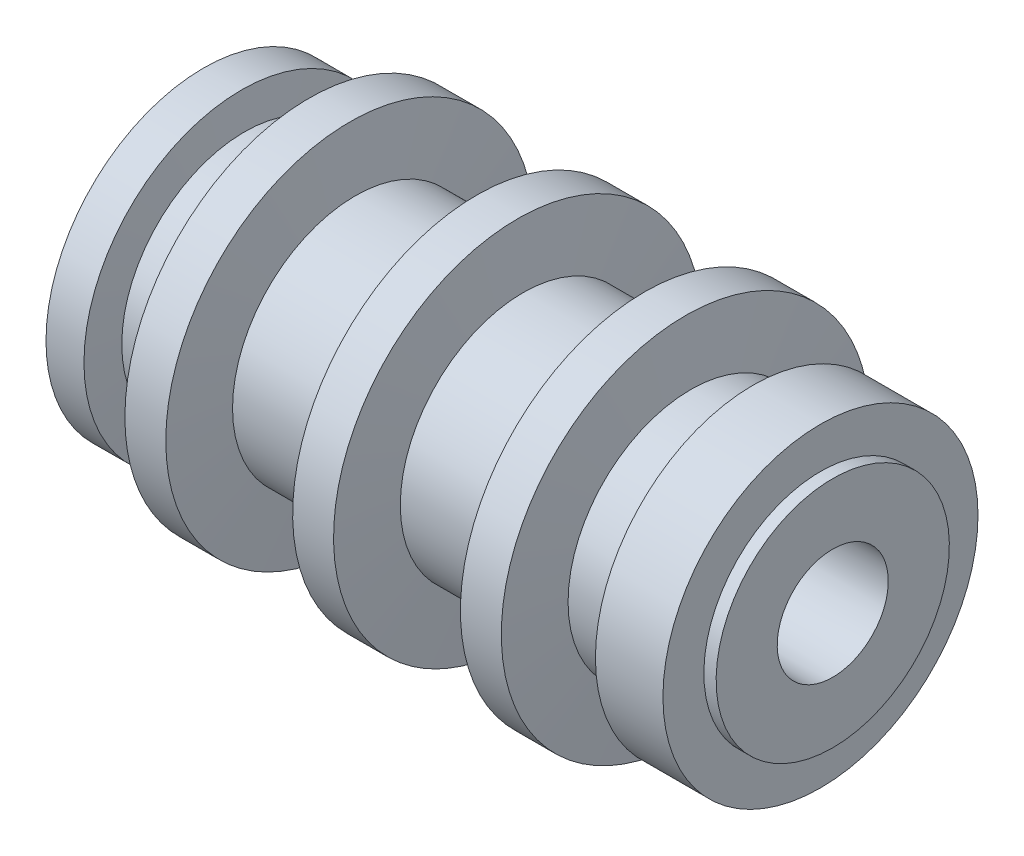
ISO-10303-21;
HEADER;
FILE_DESCRIPTION(('STEP AP214'),'2;1');
FILE_NAME('part.step','',(''),(''),'','','');
FILE_SCHEMA(('AUTOMOTIVE_DESIGN { 1 0 10303 214 1 1 1 1 }'));
ENDSEC;
DATA;
#1=APPLICATION_CONTEXT('core data for automotive mechanical design processes');
#2=APPLICATION_PROTOCOL_DEFINITION('international standard','automotive_design',2000,#1);
#3=PRODUCT_CONTEXT('',#1,'mechanical');
#4=PRODUCT('Part','Part','',(#3));
#5=PRODUCT_RELATED_PRODUCT_CATEGORY('part','',(#4));
#6=PRODUCT_DEFINITION_FORMATION('','',#4);
#7=PRODUCT_DEFINITION_CONTEXT('part definition',#1,'design');
#8=PRODUCT_DEFINITION('design','',#6,#7);
#9=PRODUCT_DEFINITION_SHAPE('','',#8);
#10=(LENGTH_UNIT() NAMED_UNIT(*) SI_UNIT(.MILLI.,.METRE.));
#11=(NAMED_UNIT(*) PLANE_ANGLE_UNIT() SI_UNIT($,.RADIAN.));
#12=(NAMED_UNIT(*) SI_UNIT($,.STERADIAN.) SOLID_ANGLE_UNIT());
#13=UNCERTAINTY_MEASURE_WITH_UNIT(LENGTH_MEASURE(1.E-05),#10,'distance_accuracy_value','');
#14=(GEOMETRIC_REPRESENTATION_CONTEXT(3) GLOBAL_UNCERTAINTY_ASSIGNED_CONTEXT((#13)) GLOBAL_UNIT_ASSIGNED_CONTEXT((#10,
#11,#12)) REPRESENTATION_CONTEXT('',''));
#15=CARTESIAN_POINT('',(0.,0.,0.));
#16=DIRECTION('',(0.,0.,1.));
#17=DIRECTION('',(1.,0.,0.));
#18=AXIS2_PLACEMENT_3D('',#15,#16,#17);
#19=CARTESIAN_POINT('',(-0.250000000000005,24.,0.));
#20=DIRECTION('',(-1.,0.,0.));
#21=DIRECTION('',(0.,0.,1.));
#22=AXIS2_PLACEMENT_3D('',#19,#20,#21);
#23=CYLINDRICAL_SURFACE('',#22,4.5);
#24=CARTESIAN_POINT('',(0.500000000009497,24.,0.));
#25=DIRECTION('',(-1.,0.,0.));
#26=DIRECTION('',(0.,0.819112477739385,-0.573632939092278));
#27=AXIS2_PLACEMENT_3D('',#24,#25,#26);
#28=CIRCLE('',#27,4.50000000002733);
#29=CARTESIAN_POINT('',(0.500000000009493,27.6860061498496,-2.58134822593092));
#30=VERTEX_POINT('',#29);
#31=EDGE_CURVE('E31',#30,#30,#28,.F.);
#32=ORIENTED_EDGE('',*,*,#31,.F.);
#33=EDGE_LOOP('',(#32));
#34=FACE_BOUND('',#33,.T.);
#35=CARTESIAN_POINT('',(-0.500000000009492,24.,0.));
#36=DIRECTION('',(1.,0.,0.));
#37=DIRECTION('',(0.,-0.819112477743409,0.573632939086532));
#38=AXIS2_PLACEMENT_3D('',#35,#36,#37);
#39=CIRCLE('',#38,4.50000000007239);
#40=CARTESIAN_POINT('',(-0.500000000009493,20.3139938500954,2.58134822593092));
#41=VERTEX_POINT('',#40);
#42=EDGE_CURVE('E91',#41,#41,#39,.F.);
#43=ORIENTED_EDGE('',*,*,#42,.F.);
#44=EDGE_LOOP('',(#43));
#45=FACE_BOUND('',#44,.T.);
#46=ADVANCED_FACE('F15',(#34,#45),#23,.T.);
#47=CARTESIAN_POINT('',(0.500000000016602,24.,0.));
#48=DIRECTION('',(-1.,0.,0.));
#49=DIRECTION('',(0.,-1.,0.));
#50=AXIS2_PLACEMENT_3D('',#47,#48,#49);
#51=CONICAL_SURFACE('',#50,4.49999999994816,1.48352986420335);
#52=ORIENTED_EDGE('',*,*,#31,.T.);
#53=EDGE_LOOP('',(#52));
#54=FACE_BOUND('',#53,.T.);
#55=CARTESIAN_POINT('',(0.631232995288885,24.,0.));
#56=DIRECTION('',(-1.,0.,0.));
#57=DIRECTION('',(0.,-1.,0.));
#58=AXIS2_PLACEMENT_3D('',#55,#56,#57);
#59=CIRCLE('',#58,3.);
#60=CARTESIAN_POINT('',(0.631232995288887,21.,0.));
#61=VERTEX_POINT('',#60);
#62=EDGE_CURVE('E89',#61,#61,#59,.F.);
#63=ORIENTED_EDGE('',*,*,#62,.F.);
#64=EDGE_LOOP('',(#63));
#65=FACE_BOUND('',#64,.T.);
#66=ADVANCED_FACE('F98',(#54,#65),#51,.T.);
#67=CARTESIAN_POINT('',(-0.500000000009492,24.,0.));
#68=DIRECTION('',(1.,0.,0.));
#69=DIRECTION('',(0.,0.,-1.));
#70=AXIS2_PLACEMENT_3D('',#67,#68,#69);
#71=CONICAL_SURFACE('',#70,4.50000000007239,1.48352986420335);
#72=CARTESIAN_POINT('',(-0.631232995288891,24.,0.));
#73=DIRECTION('',(-1.,0.,0.));
#74=DIRECTION('',(0.,0.,1.));
#75=AXIS2_PLACEMENT_3D('',#72,#73,#74);
#76=CIRCLE('',#75,3.);
#77=CARTESIAN_POINT('',(-0.631232995288892,24.,3.));
#78=VERTEX_POINT('',#77);
#79=EDGE_CURVE('E86',#78,#78,#76,.T.);
#80=ORIENTED_EDGE('',*,*,#79,.F.);
#81=EDGE_LOOP('',(#80));
#82=FACE_BOUND('',#81,.T.);
#83=ORIENTED_EDGE('',*,*,#42,.T.);
#84=EDGE_LOOP('',(#83));
#85=FACE_BOUND('',#84,.T.);
#86=ADVANCED_FACE('F107',(#82,#85),#71,.T.);
#87=CARTESIAN_POINT('',(4.1,24.,0.));
#88=DIRECTION('',(-1.,0.,0.));
#89=DIRECTION('',(0.,-1.,0.));
#90=AXIS2_PLACEMENT_3D('',#87,#88,#89);
#91=CYLINDRICAL_SURFACE('',#90,3.);
#92=ORIENTED_EDGE('',*,*,#62,.T.);
#93=EDGE_LOOP('',(#92));
#94=FACE_BOUND('',#93,.T.);
#95=CARTESIAN_POINT('',(3.46876700471199,24.,0.));
#96=DIRECTION('',(1.,0.,0.));
#97=DIRECTION('',(0.,-0.819112477740109,0.573632939091244));
#98=AXIS2_PLACEMENT_3D('',#95,#96,#97);
#99=CIRCLE('',#98,2.99999999999059);
#100=CARTESIAN_POINT('',(3.46876700471199,21.5426625667874,1.72089881726833));
#101=VERTEX_POINT('',#100);
#102=EDGE_CURVE('E83',#101,#101,#99,.T.);
#103=ORIENTED_EDGE('',*,*,#102,.F.);
#104=EDGE_LOOP('',(#103));
#105=FACE_BOUND('',#104,.T.);
#106=ADVANCED_FACE('F190',(#94,#105),#91,.T.);
#107=CARTESIAN_POINT('',(-4.1,24.,0.));
#108=DIRECTION('',(-1.,0.,0.));
#109=DIRECTION('',(0.,0.,1.));
#110=AXIS2_PLACEMENT_3D('',#107,#108,#109);
#111=CYLINDRICAL_SURFACE('',#110,3.);
#112=ORIENTED_EDGE('',*,*,#79,.T.);
#113=EDGE_LOOP('',(#112));
#114=FACE_BOUND('',#113,.T.);
#115=CARTESIAN_POINT('',(-3.4687670047191,24.,0.));
#116=DIRECTION('',(-1.,0.,0.));
#117=DIRECTION('',(0.,0.819112477731405,-0.573632939103673));
#118=AXIS2_PLACEMENT_3D('',#115,#116,#117);
#119=CIRCLE('',#118,3.00000000002469);
#120=CARTESIAN_POINT('',(-3.4687670047191,26.4573374332144,-1.72089881732518));
#121=VERTEX_POINT('',#120);
#122=EDGE_CURVE('E80',#121,#121,#119,.T.);
#123=ORIENTED_EDGE('',*,*,#122,.F.);
#124=EDGE_LOOP('',(#123));
#125=FACE_BOUND('',#124,.T.);
#126=ADVANCED_FACE('F186',(#114,#125),#111,.T.);
#127=CARTESIAN_POINT('',(3.5999999999774,24.,0.));
#128=DIRECTION('',(1.,0.,0.));
#129=DIRECTION('',(0.,1.,0.));
#130=AXIS2_PLACEMENT_3D('',#127,#128,#129);
#131=CONICAL_SURFACE('',#130,4.49999999977438,1.48352986419608);
#132=CARTESIAN_POINT('',(3.6,24.,0.));
#133=DIRECTION('',(-1.,0.,0.));
#134=DIRECTION('',(0.,-1.,0.));
#135=AXIS2_PLACEMENT_3D('',#132,#133,#134);
#136=CIRCLE('',#135,4.5);
#137=CARTESIAN_POINT('',(3.6,19.5,0.));
#138=VERTEX_POINT('',#137);
#139=EDGE_CURVE('E77',#138,#138,#136,.F.);
#140=ORIENTED_EDGE('',*,*,#139,.F.);
#141=EDGE_LOOP('',(#140));
#142=FACE_BOUND('',#141,.T.);
#143=ORIENTED_EDGE('',*,*,#102,.T.);
#144=EDGE_LOOP('',(#143));
#145=FACE_BOUND('',#144,.T.);
#146=ADVANCED_FACE('F182',(#142,#145),#131,.T.);
#147=CARTESIAN_POINT('',(-3.59999999999161,24.,0.));
#148=DIRECTION('',(-1.,0.,0.));
#149=DIRECTION('',(0.,0.,1.));
#150=AXIS2_PLACEMENT_3D('',#147,#148,#149);
#151=CONICAL_SURFACE('',#150,4.49999999994816,1.48352986419934);
#152=ORIENTED_EDGE('',*,*,#122,.T.);
#153=EDGE_LOOP('',(#152));
#154=FACE_BOUND('',#153,.T.);
#155=CARTESIAN_POINT('',(-3.60000000000001,24.,0.));
#156=DIRECTION('',(-1.,0.,0.));
#157=DIRECTION('',(0.,0.,1.));
#158=AXIS2_PLACEMENT_3D('',#155,#156,#157);
#159=CIRCLE('',#158,4.5);
#160=CARTESIAN_POINT('',(-3.60000000000001,24.,4.5));
#161=VERTEX_POINT('',#160);
#162=EDGE_CURVE('E74',#161,#161,#159,.T.);
#163=ORIENTED_EDGE('',*,*,#162,.F.);
#164=EDGE_LOOP('',(#163));
#165=FACE_BOUND('',#164,.T.);
#166=ADVANCED_FACE('F178',(#154,#165),#151,.T.);
#167=CARTESIAN_POINT('',(4.1,24.,0.));
#168=DIRECTION('',(-1.,0.,0.));
#169=DIRECTION('',(0.,-1.,0.));
#170=AXIS2_PLACEMENT_3D('',#167,#168,#169);
#171=CYLINDRICAL_SURFACE('',#170,4.5);
#172=ORIENTED_EDGE('',*,*,#139,.T.);
#173=EDGE_LOOP('',(#172));
#174=FACE_BOUND('',#173,.T.);
#175=CARTESIAN_POINT('',(4.59999999999639,24.,0.));
#176=DIRECTION('',(-1.,0.,0.));
#177=DIRECTION('',(0.,0.819112477743542,-0.573632939086343));
#178=AXIS2_PLACEMENT_3D('',#175,#176,#177);
#179=CIRCLE('',#178,4.50000000007389);
#180=CARTESIAN_POINT('',(4.59999999999638,27.6860061499065,-2.58134822593092));
#181=VERTEX_POINT('',#180);
#182=EDGE_CURVE('E71',#181,#181,#179,.F.);
#183=ORIENTED_EDGE('',*,*,#182,.F.);
#184=EDGE_LOOP('',(#183));
#185=FACE_BOUND('',#184,.T.);
#186=ADVANCED_FACE('F174',(#174,#185),#171,.T.);
#187=CARTESIAN_POINT('',(-4.1,24.,0.));
#188=DIRECTION('',(-1.,0.,0.));
#189=DIRECTION('',(0.,0.,1.));
#190=AXIS2_PLACEMENT_3D('',#187,#188,#189);
#191=CYLINDRICAL_SURFACE('',#190,4.5);
#192=ORIENTED_EDGE('',*,*,#162,.T.);
#193=EDGE_LOOP('',(#192));
#194=FACE_BOUND('',#193,.T.);
#195=CARTESIAN_POINT('',(-4.60000000000349,24.,0.));
#196=DIRECTION('',(1.,0.,0.));
#197=DIRECTION('',(0.,-0.819112477745188,0.573632939083992));
#198=AXIS2_PLACEMENT_3D('',#195,#196,#197);
#199=CIRCLE('',#198,4.49999999999322);
#200=CARTESIAN_POINT('',(-4.60000000000349,20.3139938501522,2.58134822587408));
#201=VERTEX_POINT('',#200);
#202=EDGE_CURVE('E68',#201,#201,#199,.F.);
#203=ORIENTED_EDGE('',*,*,#202,.F.);
#204=EDGE_LOOP('',(#203));
#205=FACE_BOUND('',#204,.T.);
#206=ADVANCED_FACE('F170',(#194,#205),#191,.T.);
#207=CARTESIAN_POINT('',(4.60000000000349,24.,0.));
#208=DIRECTION('',(-1.,0.,0.));
#209=DIRECTION('',(0.,-1.,0.));
#210=AXIS2_PLACEMENT_3D('',#207,#208,#209);
#211=CONICAL_SURFACE('',#210,4.49999999994816,1.48352986419865);
#212=ORIENTED_EDGE('',*,*,#182,.T.);
#213=EDGE_LOOP('',(#212));
#214=FACE_BOUND('',#213,.T.);
#215=CARTESIAN_POINT('',(4.73123299528889,24.,0.));
#216=DIRECTION('',(-1.,0.,0.));
#217=DIRECTION('',(0.,-1.,0.));
#218=AXIS2_PLACEMENT_3D('',#215,#216,#217);
#219=CIRCLE('',#218,3.);
#220=CARTESIAN_POINT('',(4.73123299528889,21.,0.));
#221=VERTEX_POINT('',#220);
#222=EDGE_CURVE('E65',#221,#221,#219,.F.);
#223=ORIENTED_EDGE('',*,*,#222,.F.);
#224=EDGE_LOOP('',(#223));
#225=FACE_BOUND('',#224,.T.);
#226=ADVANCED_FACE('F166',(#214,#225),#211,.T.);
#227=CARTESIAN_POINT('',(-4.6000000000177,24.,0.));
#228=DIRECTION('',(1.,0.,0.));
#229=DIRECTION('',(0.,0.,-1.));
#230=AXIS2_PLACEMENT_3D('',#227,#228,#229);
#231=CONICAL_SURFACE('',#230,4.4999999998675,1.48352986419889);
#232=CARTESIAN_POINT('',(-4.7312329952889,24.,0.));
#233=DIRECTION('',(-1.,0.,0.));
#234=DIRECTION('',(0.,0.,1.));
#235=AXIS2_PLACEMENT_3D('',#232,#233,#234);
#236=CIRCLE('',#235,3.);
#237=CARTESIAN_POINT('',(-4.7312329952889,24.,3.));
#238=VERTEX_POINT('',#237);
#239=EDGE_CURVE('E62',#238,#238,#236,.T.);
#240=ORIENTED_EDGE('',*,*,#239,.F.);
#241=EDGE_LOOP('',(#240));
#242=FACE_BOUND('',#241,.T.);
#243=ORIENTED_EDGE('',*,*,#202,.T.);
#244=EDGE_LOOP('',(#243));
#245=FACE_BOUND('',#244,.T.);
#246=ADVANCED_FACE('F162',(#242,#245),#231,.T.);
#247=CARTESIAN_POINT('',(4.1,24.,0.));
#248=DIRECTION('',(-1.,0.,0.));
#249=DIRECTION('',(0.,-1.,0.));
#250=AXIS2_PLACEMENT_3D('',#247,#248,#249);
#251=CYLINDRICAL_SURFACE('',#250,3.);
#252=ORIENTED_EDGE('',*,*,#222,.T.);
#253=EDGE_LOOP('',(#252));
#254=FACE_BOUND('',#253,.T.);
#255=CARTESIAN_POINT('',(6.17563463600135,24.,0.));
#256=DIRECTION('',(1.,0.,0.));
#257=DIRECTION('',(0.,-0.819112477740109,0.573632939091244));
#258=AXIS2_PLACEMENT_3D('',#255,#256,#257);
#259=CIRCLE('',#258,2.99999999999059);
#260=CARTESIAN_POINT('',(6.17563463600135,21.5426625667874,1.72089881726833));
#261=VERTEX_POINT('',#260);
#262=EDGE_CURVE('E59',#261,#261,#259,.T.);
#263=ORIENTED_EDGE('',*,*,#262,.F.);
#264=EDGE_LOOP('',(#263));
#265=FACE_BOUND('',#264,.T.);
#266=ADVANCED_FACE('F158',(#254,#265),#251,.T.);
#267=CARTESIAN_POINT('',(-4.1,24.,0.));
#268=DIRECTION('',(-1.,0.,0.));
#269=DIRECTION('',(0.,0.,1.));
#270=AXIS2_PLACEMENT_3D('',#267,#268,#269);
#271=CYLINDRICAL_SURFACE('',#270,3.);
#272=ORIENTED_EDGE('',*,*,#239,.T.);
#273=EDGE_LOOP('',(#272));
#274=FACE_BOUND('',#273,.T.);
#275=CARTESIAN_POINT('',(-6.17563463600845,24.,0.));
#276=DIRECTION('',(-1.,0.,0.));
#277=DIRECTION('',(0.,0.819112477740308,-0.57363293909096));
#278=AXIS2_PLACEMENT_3D('',#275,#276,#277);
#279=CIRCLE('',#278,2.99999999999208);
#280=CARTESIAN_POINT('',(-6.17563463600845,26.4573374332144,-1.72089881726833));
#281=VERTEX_POINT('',#280);
#282=EDGE_CURVE('E56',#281,#281,#279,.T.);
#283=ORIENTED_EDGE('',*,*,#282,.F.);
#284=EDGE_LOOP('',(#283));
#285=FACE_BOUND('',#284,.T.);
#286=ADVANCED_FACE('F154',(#274,#285),#271,.T.);
#287=CARTESIAN_POINT('',(6.25000000000852,24.,0.));
#288=DIRECTION('',(1.,0.,0.));
#289=DIRECTION('',(0.,1.,0.));
#290=AXIS2_PLACEMENT_3D('',#287,#288,#289);
#291=CONICAL_SURFACE('',#290,3.85000000005386,1.4835298641898);
#292=CARTESIAN_POINT('',(6.25,24.,0.));
#293=DIRECTION('',(-1.,0.,0.));
#294=DIRECTION('',(0.,-1.,0.));
#295=AXIS2_PLACEMENT_3D('',#292,#293,#294);
#296=CIRCLE('',#295,3.85);
#297=CARTESIAN_POINT('',(6.25,20.15,0.));
#298=VERTEX_POINT('',#297);
#299=EDGE_CURVE('E53',#298,#298,#296,.F.);
#300=ORIENTED_EDGE('',*,*,#299,.F.);
#301=EDGE_LOOP('',(#300));
#302=FACE_BOUND('',#301,.T.);
#303=ORIENTED_EDGE('',*,*,#262,.T.);
#304=EDGE_LOOP('',(#303));
#305=FACE_BOUND('',#304,.T.);
#306=ADVANCED_FACE('F150',(#302,#305),#291,.T.);
#307=CARTESIAN_POINT('',(-6.24999999998721,24.,0.));
#308=DIRECTION('',(-1.,0.,0.));
#309=DIRECTION('',(0.,0.,1.));
#310=AXIS2_PLACEMENT_3D('',#307,#308,#309);
#311=CONICAL_SURFACE('',#310,3.84999999972473,1.48352986418525);
#312=ORIENTED_EDGE('',*,*,#282,.T.);
#313=EDGE_LOOP('',(#312));
#314=FACE_BOUND('',#313,.T.);
#315=CARTESIAN_POINT('',(-6.25000000000001,24.,0.));
#316=DIRECTION('',(-1.,0.,0.));
#317=DIRECTION('',(0.,0.,1.));
#318=AXIS2_PLACEMENT_3D('',#315,#316,#317);
#319=CIRCLE('',#318,3.85);
#320=CARTESIAN_POINT('',(-6.25000000000001,24.,3.85));
#321=VERTEX_POINT('',#320);
#322=EDGE_CURVE('E48',#321,#321,#319,.T.);
#323=ORIENTED_EDGE('',*,*,#322,.F.);
#324=EDGE_LOOP('',(#323));
#325=FACE_BOUND('',#324,.T.);
#326=ADVANCED_FACE('F146',(#314,#325),#311,.T.);
#327=CARTESIAN_POINT('',(7.13751133647408,24.,0.));
#328=DIRECTION('',(-1.,0.,0.));
#329=DIRECTION('',(0.,-1.,0.));
#330=AXIS2_PLACEMENT_3D('',#327,#328,#329);
#331=CYLINDRICAL_SURFACE('',#330,3.85);
#332=ORIENTED_EDGE('',*,*,#299,.T.);
#333=EDGE_LOOP('',(#332));
#334=FACE_BOUND('',#333,.T.);
#335=CARTESIAN_POINT('',(7.9,24.,0.));
#336=DIRECTION('',(-1.,0.,0.));
#337=DIRECTION('',(0.,-1.,0.));
#338=AXIS2_PLACEMENT_3D('',#335,#336,#337);
#339=CIRCLE('',#338,3.85);
#340=CARTESIAN_POINT('',(7.9,20.15,0.));
#341=VERTEX_POINT('',#340);
#342=EDGE_CURVE('E18',#341,#341,#339,.T.);
#343=ORIENTED_EDGE('',*,*,#342,.T.);
#344=EDGE_LOOP('',(#343));
#345=FACE_BOUND('',#344,.T.);
#346=ADVANCED_FACE('F142',(#334,#345),#331,.T.);
#347=CARTESIAN_POINT('',(-7.13751133647408,24.,0.));
#348=DIRECTION('',(-1.,0.,0.));
#349=DIRECTION('',(0.,0.,1.));
#350=AXIS2_PLACEMENT_3D('',#347,#348,#349);
#351=CYLINDRICAL_SURFACE('',#350,3.85);
#352=ORIENTED_EDGE('',*,*,#322,.T.);
#353=EDGE_LOOP('',(#352));
#354=FACE_BOUND('',#353,.T.);
#355=CARTESIAN_POINT('',(-7.17774648713743,24.,0.));
#356=DIRECTION('',(1.,0.,0.));
#357=DIRECTION('',(0.,-0.819112477740235,0.573632939091064));
#358=AXIS2_PLACEMENT_3D('',#355,#356,#357);
#359=CIRCLE('',#358,3.8500000000073);
#360=CARTESIAN_POINT('',(-7.17774648713743,20.8464169606941,2.20848681550478));
#361=VERTEX_POINT('',#360);
#362=EDGE_CURVE('E38',#361,#361,#359,.F.);
#363=ORIENTED_EDGE('',*,*,#362,.F.);
#364=EDGE_LOOP('',(#363));
#365=FACE_BOUND('',#364,.T.);
#366=ADVANCED_FACE('F138',(#354,#365),#351,.T.);
#367=CARTESIAN_POINT('',(7.9,26.3344705615715,-1.6348538763926));
#368=DIRECTION('',(-1.,0.,0.));
#369=DIRECTION('',(0.,-1.,0.));
#370=AXIS2_PLACEMENT_3D('',#367,#368,#369);
#371=PLANE('',#370);
#372=ORIENTED_EDGE('',*,*,#342,.F.);
#373=EDGE_LOOP('',(#372));
#374=FACE_BOUND('',#373,.T.);
#375=CARTESIAN_POINT('',(7.9,24.,0.));
#376=DIRECTION('',(-1.,0.,0.));
#377=DIRECTION('',(0.,-1.,0.));
#378=AXIS2_PLACEMENT_3D('',#375,#376,#377);
#379=CIRCLE('',#378,2.85);
#380=CARTESIAN_POINT('',(7.9,21.15,0.));
#381=VERTEX_POINT('',#380);
#382=EDGE_CURVE('E36',#381,#381,#379,.F.);
#383=ORIENTED_EDGE('',*,*,#382,.F.);
#384=EDGE_LOOP('',(#383));
#385=FACE_BOUND('',#384,.T.);
#386=ADVANCED_FACE('F134',(#374,#385),#371,.F.);
#387=CARTESIAN_POINT('',(-7.1777464871392,24.,0.));
#388=DIRECTION('',(1.,0.,0.));
#389=DIRECTION('',(0.,1.,0.));
#390=AXIS2_PLACEMENT_3D('',#387,#388,#389);
#391=CONICAL_SURFACE('',#390,3.8499999998024,1.56206968054002);
#392=CARTESIAN_POINT('',(-7.19520022271508,24.,0.));
#393=DIRECTION('',(-1.,0.,0.));
#394=DIRECTION('',(0.,-1.,0.));
#395=AXIS2_PLACEMENT_3D('',#392,#393,#394);
#396=CIRCLE('',#395,1.85);
#397=CARTESIAN_POINT('',(-7.19520022271508,22.15,0.));
#398=VERTEX_POINT('',#397);
#399=EDGE_CURVE('E35',#398,#398,#396,.T.);
#400=ORIENTED_EDGE('',*,*,#399,.F.);
#401=EDGE_LOOP('',(#400));
#402=FACE_BOUND('',#401,.T.);
#403=ORIENTED_EDGE('',*,*,#362,.T.);
#404=EDGE_LOOP('',(#403));
#405=FACE_BOUND('',#404,.T.);
#406=ADVANCED_FACE('F131',(#402,#405),#391,.T.);
#407=CARTESIAN_POINT('',(8.00625566823704,24.,0.));
#408=DIRECTION('',(-1.,0.,0.));
#409=DIRECTION('',(0.,-1.,0.));
#410=AXIS2_PLACEMENT_3D('',#407,#408,#409);
#411=CYLINDRICAL_SURFACE('',#410,2.85);
#412=ORIENTED_EDGE('',*,*,#382,.T.);
#413=EDGE_LOOP('',(#412));
#414=FACE_BOUND('',#413,.T.);
#415=CARTESIAN_POINT('',(8.2,24.,0.));
#416=DIRECTION('',(-1.,0.,0.));
#417=DIRECTION('',(0.,-1.,0.));
#418=AXIS2_PLACEMENT_3D('',#415,#416,#417);
#419=CIRCLE('',#418,2.85);
#420=CARTESIAN_POINT('',(8.2,21.15,0.));
#421=VERTEX_POINT('',#420);
#422=EDGE_CURVE('E33',#421,#421,#419,.T.);
#423=ORIENTED_EDGE('',*,*,#422,.T.);
#424=EDGE_LOOP('',(#423));
#425=FACE_BOUND('',#424,.T.);
#426=ADVANCED_FACE('F127',(#414,#425),#411,.T.);
#427=CARTESIAN_POINT('',(-7.69520022271508,24.,0.));
#428=DIRECTION('',(-1.,0.,0.));
#429=DIRECTION('',(0.,-1.,0.));
#430=AXIS2_PLACEMENT_3D('',#427,#428,#429);
#431=CYLINDRICAL_SURFACE('',#430,1.85);
#432=CARTESIAN_POINT('',(-8.19520022271636,24.,0.));
#433=DIRECTION('',(1.,0.,0.));
#434=DIRECTION('',(0.,-0.573632939086341,-0.819112477743543));
#435=AXIS2_PLACEMENT_3D('',#432,#433,#434);
#436=CIRCLE('',#435,1.84999999996052);
#437=CARTESIAN_POINT('',(-8.19520022271636,22.9387790627129,-1.51535808379322));
#438=VERTEX_POINT('',#437);
#439=EDGE_CURVE('E27',#438,#438,#436,.F.);
#440=ORIENTED_EDGE('',*,*,#439,.F.);
#441=EDGE_LOOP('',(#440));
#442=FACE_BOUND('',#441,.T.);
#443=ORIENTED_EDGE('',*,*,#399,.T.);
#444=EDGE_LOOP('',(#443));
#445=FACE_BOUND('',#444,.T.);
#446=ADVANCED_FACE('F123',(#442,#445),#431,.T.);
#447=CARTESIAN_POINT('',(8.2,25.0648462210677,-0.745722820810659));
#448=DIRECTION('',(-1.,0.,0.));
#449=DIRECTION('',(0.,-1.,0.));
#450=AXIS2_PLACEMENT_3D('',#447,#448,#449);
#451=PLANE('',#450);
#452=ORIENTED_EDGE('',*,*,#422,.F.);
#453=EDGE_LOOP('',(#452));
#454=FACE_BOUND('',#453,.T.);
#455=CARTESIAN_POINT('',(8.19999999998799,24.,0.));
#456=DIRECTION('',(1.,0.,0.));
#457=DIRECTION('',(0.,1.,0.));
#458=AXIS2_PLACEMENT_3D('',#455,#456,#457);
#459=CIRCLE('',#458,1.35724703197832);
#460=CARTESIAN_POINT('',(8.19999999998799,25.3572470319783,0.));
#461=VERTEX_POINT('',#460);
#462=EDGE_CURVE('E10',#461,#461,#459,.F.);
#463=ORIENTED_EDGE('',*,*,#462,.T.);
#464=EDGE_LOOP('',(#463));
#465=FACE_BOUND('',#464,.T.);
#466=ADVANCED_FACE('F116',(#454,#465),#451,.F.);
#467=CARTESIAN_POINT('',(-8.19520022271725,24.,0.));
#468=DIRECTION('',(1.,0.,0.));
#469=DIRECTION('',(0.,0.,-1.));
#470=AXIS2_PLACEMENT_3D('',#467,#468,#469);
#471=CONICAL_SURFACE('',#470,1.84999999988135,1.56206968053974);
#472=ORIENTED_EDGE('',*,*,#439,.T.);
#473=EDGE_LOOP('',(#472));
#474=FACE_BOUND('',#473,.T.);
#475=CARTESIAN_POINT('',(-8.19999999998799,24.,0.));
#476=DIRECTION('',(1.,0.,0.));
#477=DIRECTION('',(0.,-0.819112477744403,0.573632939085113));
#478=AXIS2_PLACEMENT_3D('',#475,#476,#477);
#479=CIRCLE('',#478,1.30000000000039);
#480=CARTESIAN_POINT('',(-8.19999999998799,22.935153778932,0.745722820810868));
#481=VERTEX_POINT('',#480);
#482=EDGE_CURVE('E22',#481,#481,#479,.T.);
#483=ORIENTED_EDGE('',*,*,#482,.T.);
#484=EDGE_LOOP('',(#483));
#485=FACE_BOUND('',#484,.T.);
#486=ADVANCED_FACE('F110',(#474,#485),#471,.T.);
#487=CARTESIAN_POINT('',(8.19999999993115,24.,0.));
#488=DIRECTION('',(1.,0.,0.));
#489=DIRECTION('',(0.,1.,0.));
#490=AXIS2_PLACEMENT_3D('',#487,#488,#489);
#491=CONICAL_SURFACE('',#490,1.35724703197812,0.00349065850397566);
#492=ORIENTED_EDGE('',*,*,#462,.F.);
#493=EDGE_LOOP('',(#492));
#494=FACE_BOUND('',#493,.T.);
#495=ORIENTED_EDGE('',*,*,#482,.F.);
#496=EDGE_LOOP('',(#495));
#497=FACE_BOUND('',#496,.T.);
#498=ADVANCED_FACE('F108',(#494,#497),#491,.F.);
#499=CLOSED_SHELL('',(#46,#66,#86,#106,#126,#146,#166,#186,#206,#226,#246,#266,#286,#306,#326,
#346,#366,#386,#406,#426,#446,#466,#486,#498));
#500=MANIFOLD_SOLID_BREP('B1',#499);
#501=ADVANCED_BREP_SHAPE_REPRESENTATION('',(#18,#500),#14);
#502=SHAPE_DEFINITION_REPRESENTATION(#9,#501);
ENDSEC;
END-ISO-10303-21;
